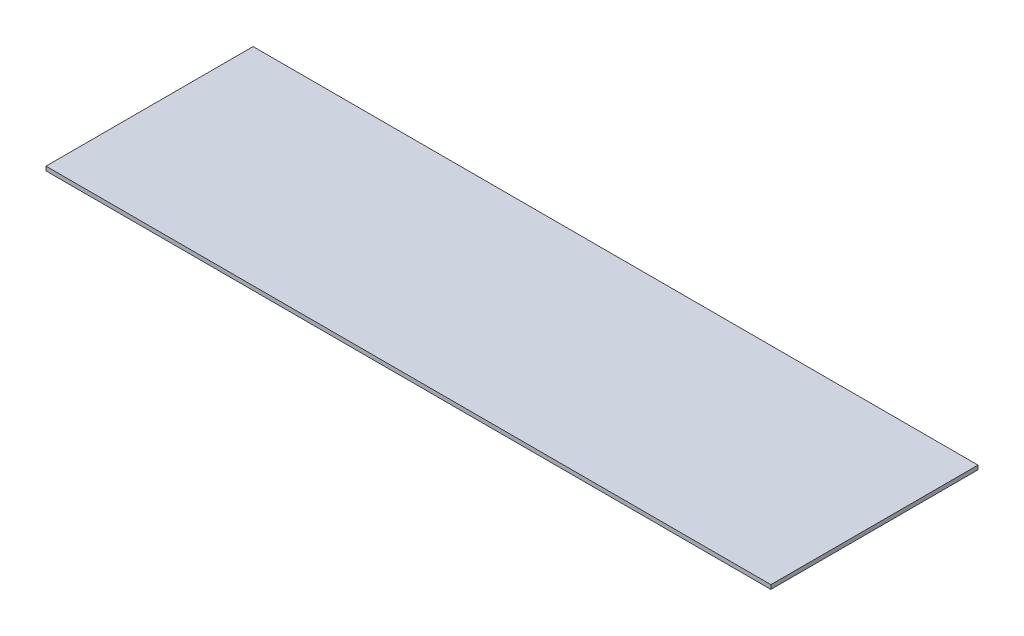
ISO-10303-21;
HEADER;
FILE_DESCRIPTION(('STEP AP214'),'2;1');
FILE_NAME('part.step','',(''),(''),'','','');
FILE_SCHEMA(('AUTOMOTIVE_DESIGN { 1 0 10303 214 1 1 1 1 }'));
ENDSEC;
DATA;
#1=APPLICATION_CONTEXT('core data for automotive mechanical design processes');
#2=APPLICATION_PROTOCOL_DEFINITION('international standard','automotive_design',2000,#1);
#3=PRODUCT_CONTEXT('',#1,'mechanical');
#4=PRODUCT('Part','Part','',(#3));
#5=PRODUCT_RELATED_PRODUCT_CATEGORY('part','',(#4));
#6=PRODUCT_DEFINITION_FORMATION('','',#4);
#7=PRODUCT_DEFINITION_CONTEXT('part definition',#1,'design');
#8=PRODUCT_DEFINITION('design','',#6,#7);
#9=PRODUCT_DEFINITION_SHAPE('','',#8);
#10=(LENGTH_UNIT() NAMED_UNIT(*) SI_UNIT(.MILLI.,.METRE.));
#11=(NAMED_UNIT(*) PLANE_ANGLE_UNIT() SI_UNIT($,.RADIAN.));
#12=(NAMED_UNIT(*) SI_UNIT($,.STERADIAN.) SOLID_ANGLE_UNIT());
#13=UNCERTAINTY_MEASURE_WITH_UNIT(LENGTH_MEASURE(1.E-05),#10,'distance_accuracy_value','');
#14=(GEOMETRIC_REPRESENTATION_CONTEXT(3) GLOBAL_UNCERTAINTY_ASSIGNED_CONTEXT((#13)) GLOBAL_UNIT_ASSIGNED_CONTEXT((#10,
#11,#12)) REPRESENTATION_CONTEXT('',''));
#15=CARTESIAN_POINT('',(0.,0.,0.));
#16=DIRECTION('',(0.,0.,1.));
#17=DIRECTION('',(1.,0.,0.));
#18=AXIS2_PLACEMENT_3D('',#15,#16,#17);
#19=CARTESIAN_POINT('',(0.,2.,0.));
#20=DIRECTION('',(1.,0.,0.));
#21=DIRECTION('',(0.,0.,-1.));
#22=AXIS2_PLACEMENT_3D('',#19,#20,#21);
#23=PLANE('',#22);
#24=DIRECTION('',(0.,0.,1.));
#25=VECTOR('',#24,1.);
#26=CARTESIAN_POINT('',(0.,0.,0.));
#27=LINE('',#26,#25);
#28=CARTESIAN_POINT('',(0.,0.,0.));
#29=VERTEX_POINT('',#28);
#30=CARTESIAN_POINT('',(0.,0.,100.));
#31=VERTEX_POINT('',#30);
#32=EDGE_CURVE('E96',#29,#31,#27,.T.);
#33=ORIENTED_EDGE('',*,*,#32,.T.);
#34=DIRECTION('',(0.,-1.,0.));
#35=VECTOR('',#34,1.);
#36=CARTESIAN_POINT('',(0.,2.,100.));
#37=LINE('',#36,#35);
#38=CARTESIAN_POINT('',(0.,2.,100.));
#39=VERTEX_POINT('',#38);
#40=EDGE_CURVE('E11',#39,#31,#37,.T.);
#41=ORIENTED_EDGE('',*,*,#40,.F.);
#42=DIRECTION('',(0.,0.,1.));
#43=VECTOR('',#42,1.);
#44=CARTESIAN_POINT('',(0.,2.,0.));
#45=LINE('',#44,#43);
#46=CARTESIAN_POINT('',(0.,2.,0.));
#47=VERTEX_POINT('',#46);
#48=EDGE_CURVE('E84',#47,#39,#45,.T.);
#49=ORIENTED_EDGE('',*,*,#48,.F.);
#50=DIRECTION('',(0.,-1.,0.));
#51=VECTOR('',#50,1.);
#52=CARTESIAN_POINT('',(0.,2.,0.));
#53=LINE('',#52,#51);
#54=EDGE_CURVE('E92',#47,#29,#53,.T.);
#55=ORIENTED_EDGE('',*,*,#54,.T.);
#56=EDGE_LOOP('',(#33,#41,#49,#55));
#57=FACE_BOUND('',#56,.T.);
#58=ADVANCED_FACE('F33',(#57),#23,.F.);
#59=CARTESIAN_POINT('',(0.,2.,100.));
#60=DIRECTION('',(0.,0.,-1.));
#61=DIRECTION('',(-1.,0.,0.));
#62=AXIS2_PLACEMENT_3D('',#59,#60,#61);
#63=PLANE('',#62);
#64=DIRECTION('',(1.,0.,0.));
#65=VECTOR('',#64,1.);
#66=CARTESIAN_POINT('',(0.,0.,100.));
#67=LINE('',#66,#65);
#68=CARTESIAN_POINT('',(350.,0.,100.));
#69=VERTEX_POINT('',#68);
#70=EDGE_CURVE('E88',#31,#69,#67,.T.);
#71=ORIENTED_EDGE('',*,*,#70,.T.);
#72=DIRECTION('',(0.,-1.,0.));
#73=VECTOR('',#72,1.);
#74=CARTESIAN_POINT('',(350.,2.,100.));
#75=LINE('',#74,#73);
#76=CARTESIAN_POINT('',(350.,2.,100.));
#77=VERTEX_POINT('',#76);
#78=EDGE_CURVE('E41',#77,#69,#75,.T.);
#79=ORIENTED_EDGE('',*,*,#78,.F.);
#80=DIRECTION('',(1.,0.,0.));
#81=VECTOR('',#80,1.);
#82=CARTESIAN_POINT('',(0.,2.,100.));
#83=LINE('',#82,#81);
#84=EDGE_CURVE('E79',#39,#77,#83,.T.);
#85=ORIENTED_EDGE('',*,*,#84,.F.);
#86=ORIENTED_EDGE('',*,*,#40,.T.);
#87=EDGE_LOOP('',(#71,#79,#85,#86));
#88=FACE_BOUND('',#87,.T.);
#89=ADVANCED_FACE('F87',(#88),#63,.F.);
#90=CARTESIAN_POINT('',(350.,2.,0.));
#91=DIRECTION('',(-1.,0.,0.));
#92=DIRECTION('',(0.,0.,1.));
#93=AXIS2_PLACEMENT_3D('',#90,#91,#92);
#94=PLANE('',#93);
#95=DIRECTION('',(0.,0.,-1.));
#96=VECTOR('',#95,1.);
#97=CARTESIAN_POINT('',(350.,0.,0.));
#98=LINE('',#97,#96);
#99=CARTESIAN_POINT('',(350.,0.,0.));
#100=VERTEX_POINT('',#99);
#101=EDGE_CURVE('E66',#69,#100,#98,.T.);
#102=ORIENTED_EDGE('',*,*,#101,.T.);
#103=DIRECTION('',(0.,-1.,0.));
#104=VECTOR('',#103,1.);
#105=CARTESIAN_POINT('',(350.,2.,0.));
#106=LINE('',#105,#104);
#107=CARTESIAN_POINT('',(350.,2.,0.));
#108=VERTEX_POINT('',#107);
#109=EDGE_CURVE('E89',#108,#100,#106,.T.);
#110=ORIENTED_EDGE('',*,*,#109,.F.);
#111=DIRECTION('',(0.,0.,-1.));
#112=VECTOR('',#111,1.);
#113=CARTESIAN_POINT('',(350.,2.,0.));
#114=LINE('',#113,#112);
#115=EDGE_CURVE('E82',#77,#108,#114,.T.);
#116=ORIENTED_EDGE('',*,*,#115,.F.);
#117=ORIENTED_EDGE('',*,*,#78,.T.);
#118=EDGE_LOOP('',(#102,#110,#116,#117));
#119=FACE_BOUND('',#118,.T.);
#120=ADVANCED_FACE('F90',(#119),#94,.F.);
#121=CARTESIAN_POINT('',(0.,2.,0.));
#122=DIRECTION('',(0.,0.,1.));
#123=DIRECTION('',(1.,0.,0.));
#124=AXIS2_PLACEMENT_3D('',#121,#122,#123);
#125=PLANE('',#124);
#126=DIRECTION('',(-1.,0.,0.));
#127=VECTOR('',#126,1.);
#128=CARTESIAN_POINT('',(0.,0.,0.));
#129=LINE('',#128,#127);
#130=EDGE_CURVE('E72',#100,#29,#129,.T.);
#131=ORIENTED_EDGE('',*,*,#130,.T.);
#132=ORIENTED_EDGE('',*,*,#54,.F.);
#133=DIRECTION('',(-1.,0.,0.));
#134=VECTOR('',#133,1.);
#135=CARTESIAN_POINT('',(0.,2.,0.));
#136=LINE('',#135,#134);
#137=EDGE_CURVE('E49',#108,#47,#136,.T.);
#138=ORIENTED_EDGE('',*,*,#137,.F.);
#139=ORIENTED_EDGE('',*,*,#109,.T.);
#140=EDGE_LOOP('',(#131,#132,#138,#139));
#141=FACE_BOUND('',#140,.T.);
#142=ADVANCED_FACE('F103',(#141),#125,.F.);
#143=CARTESIAN_POINT('',(0.,2.,0.));
#144=DIRECTION('',(0.,1.,0.));
#145=DIRECTION('',(0.,0.,1.));
#146=AXIS2_PLACEMENT_3D('',#143,#144,#145);
#147=PLANE('',#146);
#148=ORIENTED_EDGE('',*,*,#48,.T.);
#149=ORIENTED_EDGE('',*,*,#84,.T.);
#150=ORIENTED_EDGE('',*,*,#115,.T.);
#151=ORIENTED_EDGE('',*,*,#137,.T.);
#152=EDGE_LOOP('',(#148,#149,#150,#151));
#153=FACE_BOUND('',#152,.T.);
#154=ADVANCED_FACE('F80',(#153),#147,.T.);
#155=CARTESIAN_POINT('',(0.,0.,0.));
#156=DIRECTION('',(0.,1.,0.));
#157=DIRECTION('',(0.,0.,1.));
#158=AXIS2_PLACEMENT_3D('',#155,#156,#157);
#159=PLANE('',#158);
#160=ORIENTED_EDGE('',*,*,#32,.F.);
#161=ORIENTED_EDGE('',*,*,#130,.F.);
#162=ORIENTED_EDGE('',*,*,#101,.F.);
#163=ORIENTED_EDGE('',*,*,#70,.F.);
#164=EDGE_LOOP('',(#160,#161,#162,#163));
#165=FACE_BOUND('',#164,.T.);
#166=ADVANCED_FACE('F106',(#165),#159,.F.);
#167=CLOSED_SHELL('',(#58,#89,#120,#142,#154,#166));
#168=MANIFOLD_SOLID_BREP('B2',#167);
#169=ADVANCED_BREP_SHAPE_REPRESENTATION('',(#18,#168),#14);
#170=SHAPE_DEFINITION_REPRESENTATION(#9,#169);
ENDSEC;
END-ISO-10303-21;
